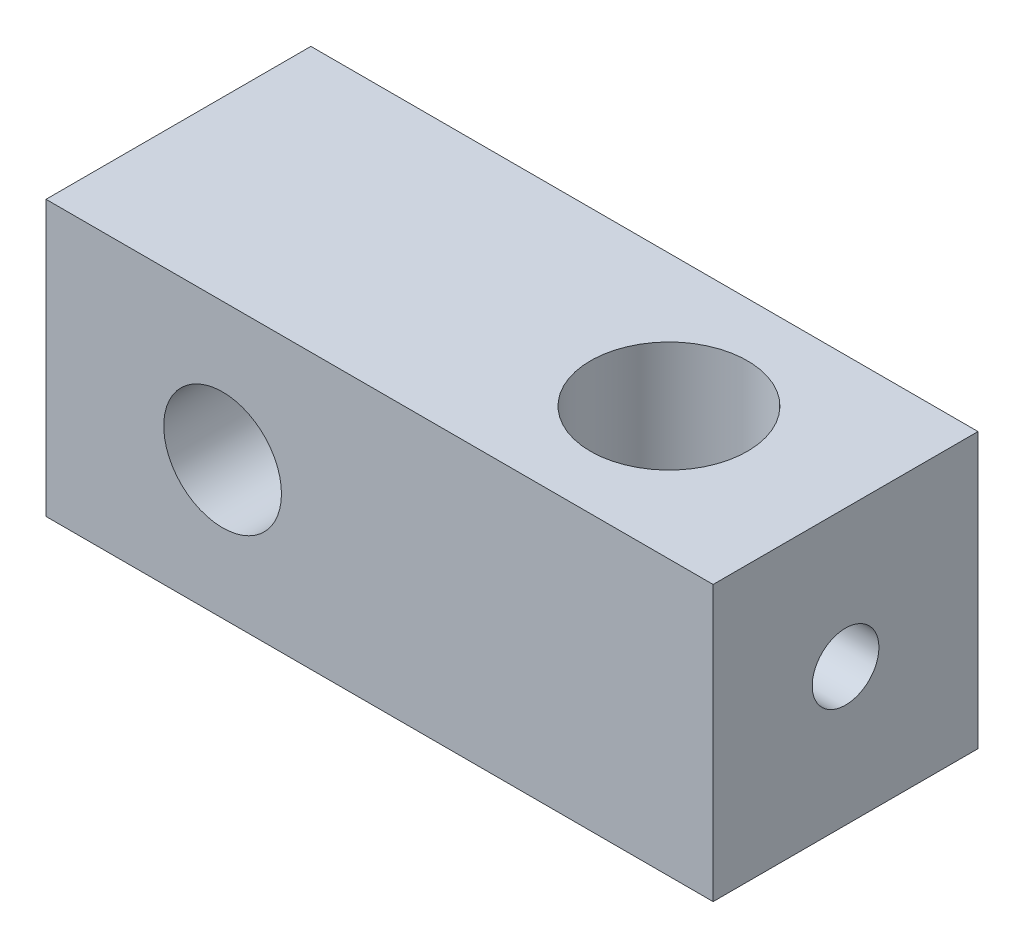
ISO-10303-21;
HEADER;
FILE_DESCRIPTION(('STEP AP214'),'2;1');
FILE_NAME('part.step','',(''),(''),'','','');
FILE_SCHEMA(('AUTOMOTIVE_DESIGN { 1 0 10303 214 1 1 1 1 }'));
ENDSEC;
DATA;
#1=APPLICATION_CONTEXT('core data for automotive mechanical design processes');
#2=APPLICATION_PROTOCOL_DEFINITION('international standard','automotive_design',2000,#1);
#3=PRODUCT_CONTEXT('',#1,'mechanical');
#4=PRODUCT('Part','Part','',(#3));
#5=PRODUCT_RELATED_PRODUCT_CATEGORY('part','',(#4));
#6=PRODUCT_DEFINITION_FORMATION('','',#4);
#7=PRODUCT_DEFINITION_CONTEXT('part definition',#1,'design');
#8=PRODUCT_DEFINITION('design','',#6,#7);
#9=PRODUCT_DEFINITION_SHAPE('','',#8);
#10=(LENGTH_UNIT() NAMED_UNIT(*) SI_UNIT(.MILLI.,.METRE.));
#11=(NAMED_UNIT(*) PLANE_ANGLE_UNIT() SI_UNIT($,.RADIAN.));
#12=(NAMED_UNIT(*) SI_UNIT($,.STERADIAN.) SOLID_ANGLE_UNIT());
#13=UNCERTAINTY_MEASURE_WITH_UNIT(LENGTH_MEASURE(1.E-05),#10,'distance_accuracy_value','');
#14=(GEOMETRIC_REPRESENTATION_CONTEXT(3) GLOBAL_UNCERTAINTY_ASSIGNED_CONTEXT((#13)) GLOBAL_UNIT_ASSIGNED_CONTEXT((#10,
#11,#12)) REPRESENTATION_CONTEXT('',''));
#15=CARTESIAN_POINT('',(0.,0.,0.));
#16=DIRECTION('',(0.,0.,1.));
#17=DIRECTION('',(1.,0.,0.));
#18=AXIS2_PLACEMENT_3D('',#15,#16,#17);
#19=CARTESIAN_POINT('',(0.,28.,0.));
#20=DIRECTION('',(1.,0.,0.));
#21=DIRECTION('',(0.,0.,-1.));
#22=AXIS2_PLACEMENT_3D('',#19,#20,#21);
#23=PLANE('',#22);
#24=DIRECTION('',(0.,0.,1.));
#25=VECTOR('',#24,1.);
#26=CARTESIAN_POINT('',(0.,0.,0.));
#27=LINE('',#26,#25);
#28=CARTESIAN_POINT('',(0.,0.,-27.));
#29=VERTEX_POINT('',#28);
#30=CARTESIAN_POINT('',(0.,0.,0.));
#31=VERTEX_POINT('',#30);
#32=EDGE_CURVE('E121',#29,#31,#27,.T.);
#33=ORIENTED_EDGE('',*,*,#32,.T.);
#34=DIRECTION('',(0.,-1.,0.));
#35=VECTOR('',#34,1.);
#36=CARTESIAN_POINT('',(0.,28.,0.));
#37=LINE('',#36,#35);
#38=CARTESIAN_POINT('',(0.,28.,0.));
#39=VERTEX_POINT('',#38);
#40=EDGE_CURVE('E11',#39,#31,#37,.T.);
#41=ORIENTED_EDGE('',*,*,#40,.F.);
#42=DIRECTION('',(0.,0.,1.));
#43=VECTOR('',#42,1.);
#44=CARTESIAN_POINT('',(0.,28.,0.));
#45=LINE('',#44,#43);
#46=CARTESIAN_POINT('',(0.,28.,-27.));
#47=VERTEX_POINT('',#46);
#48=EDGE_CURVE('E104',#47,#39,#45,.T.);
#49=ORIENTED_EDGE('',*,*,#48,.F.);
#50=DIRECTION('',(0.,-1.,0.));
#51=VECTOR('',#50,1.);
#52=CARTESIAN_POINT('',(0.,28.,-27.));
#53=LINE('',#52,#51);
#54=EDGE_CURVE('E117',#47,#29,#53,.T.);
#55=ORIENTED_EDGE('',*,*,#54,.T.);
#56=EDGE_LOOP('',(#33,#41,#49,#55));
#57=FACE_BOUND('',#56,.T.);
#58=ADVANCED_FACE('F45',(#57),#23,.F.);
#59=CARTESIAN_POINT('',(0.,28.,0.));
#60=DIRECTION('',(0.,0.,-1.));
#61=DIRECTION('',(-1.,0.,0.));
#62=AXIS2_PLACEMENT_3D('',#59,#60,#61);
#63=PLANE('',#62);
#64=CARTESIAN_POINT('',(18.,14.,0.));
#65=DIRECTION('',(0.,0.,1.));
#66=DIRECTION('',(1.,0.,0.));
#67=AXIS2_PLACEMENT_3D('',#64,#65,#66);
#68=CIRCLE('',#67,6.);
#69=CARTESIAN_POINT('',(24.,14.,0.));
#70=VERTEX_POINT('',#69);
#71=EDGE_CURVE('E137',#70,#70,#68,.T.);
#72=ORIENTED_EDGE('',*,*,#71,.F.);
#73=EDGE_LOOP('',(#72));
#74=FACE_BOUND('',#73,.T.);
#75=DIRECTION('',(1.,0.,0.));
#76=VECTOR('',#75,1.);
#77=CARTESIAN_POINT('',(0.,0.,0.));
#78=LINE('',#77,#76);
#79=CARTESIAN_POINT('',(68.,0.,0.));
#80=VERTEX_POINT('',#79);
#81=EDGE_CURVE('E109',#31,#80,#78,.T.);
#82=ORIENTED_EDGE('',*,*,#81,.T.);
#83=DIRECTION('',(0.,-1.,0.));
#84=VECTOR('',#83,1.);
#85=CARTESIAN_POINT('',(68.,28.,0.));
#86=LINE('',#85,#84);
#87=CARTESIAN_POINT('',(68.,28.,0.));
#88=VERTEX_POINT('',#87);
#89=EDGE_CURVE('E60',#88,#80,#86,.T.);
#90=ORIENTED_EDGE('',*,*,#89,.F.);
#91=DIRECTION('',(1.,0.,0.));
#92=VECTOR('',#91,1.);
#93=CARTESIAN_POINT('',(0.,28.,0.));
#94=LINE('',#93,#92);
#95=EDGE_CURVE('E99',#39,#88,#94,.T.);
#96=ORIENTED_EDGE('',*,*,#95,.F.);
#97=ORIENTED_EDGE('',*,*,#40,.T.);
#98=EDGE_LOOP('',(#82,#90,#96,#97));
#99=FACE_BOUND('',#98,.T.);
#100=ADVANCED_FACE('F108',(#74,#99),#63,.F.);
#101=CARTESIAN_POINT('',(68.,28.,0.));
#102=DIRECTION('',(-1.,0.,0.));
#103=DIRECTION('',(0.,0.,1.));
#104=AXIS2_PLACEMENT_3D('',#101,#102,#103);
#105=PLANE('',#104);
#106=CARTESIAN_POINT('',(68.,14.,-13.5));
#107=DIRECTION('',(1.,0.,0.));
#108=DIRECTION('',(0.,0.,-1.));
#109=AXIS2_PLACEMENT_3D('',#106,#107,#108);
#110=CIRCLE('',#109,3.4);
#111=CARTESIAN_POINT('',(68.,14.,-16.9));
#112=VERTEX_POINT('',#111);
#113=EDGE_CURVE('E155',#112,#112,#110,.T.);
#114=ORIENTED_EDGE('',*,*,#113,.F.);
#115=EDGE_LOOP('',(#114));
#116=FACE_BOUND('',#115,.T.);
#117=DIRECTION('',(0.,0.,-1.));
#118=VECTOR('',#117,1.);
#119=CARTESIAN_POINT('',(68.,0.,0.));
#120=LINE('',#119,#118);
#121=CARTESIAN_POINT('',(68.,0.,-27.));
#122=VERTEX_POINT('',#121);
#123=EDGE_CURVE('E86',#80,#122,#120,.T.);
#124=ORIENTED_EDGE('',*,*,#123,.T.);
#125=DIRECTION('',(0.,-1.,0.));
#126=VECTOR('',#125,1.);
#127=CARTESIAN_POINT('',(68.,28.,-27.));
#128=LINE('',#127,#126);
#129=CARTESIAN_POINT('',(68.,28.,-27.));
#130=VERTEX_POINT('',#129);
#131=EDGE_CURVE('E111',#130,#122,#128,.T.);
#132=ORIENTED_EDGE('',*,*,#131,.F.);
#133=DIRECTION('',(0.,0.,-1.));
#134=VECTOR('',#133,1.);
#135=CARTESIAN_POINT('',(68.,28.,0.));
#136=LINE('',#135,#134);
#137=EDGE_CURVE('E102',#88,#130,#136,.T.);
#138=ORIENTED_EDGE('',*,*,#137,.F.);
#139=ORIENTED_EDGE('',*,*,#89,.T.);
#140=EDGE_LOOP('',(#124,#132,#138,#139));
#141=FACE_BOUND('',#140,.T.);
#142=ADVANCED_FACE('F113',(#116,#141),#105,.F.);
#143=CARTESIAN_POINT('',(0.,28.,-27.));
#144=DIRECTION('',(0.,0.,1.));
#145=DIRECTION('',(1.,0.,0.));
#146=AXIS2_PLACEMENT_3D('',#143,#144,#145);
#147=PLANE('',#146);
#148=CARTESIAN_POINT('',(18.,14.,-27.));
#149=DIRECTION('',(0.,0.,1.));
#150=DIRECTION('',(1.,0.,0.));
#151=AXIS2_PLACEMENT_3D('',#148,#149,#150);
#152=CIRCLE('',#151,6.);
#153=CARTESIAN_POINT('',(24.,14.,-27.));
#154=VERTEX_POINT('',#153);
#155=EDGE_CURVE('E125',#154,#154,#152,.T.);
#156=ORIENTED_EDGE('',*,*,#155,.T.);
#157=EDGE_LOOP('',(#156));
#158=FACE_BOUND('',#157,.T.);
#159=DIRECTION('',(-1.,0.,0.));
#160=VECTOR('',#159,1.);
#161=CARTESIAN_POINT('',(0.,0.,-27.));
#162=LINE('',#161,#160);
#163=EDGE_CURVE('E92',#122,#29,#162,.T.);
#164=ORIENTED_EDGE('',*,*,#163,.T.);
#165=ORIENTED_EDGE('',*,*,#54,.F.);
#166=DIRECTION('',(-1.,0.,0.));
#167=VECTOR('',#166,1.);
#168=CARTESIAN_POINT('',(0.,28.,-27.));
#169=LINE('',#168,#167);
#170=EDGE_CURVE('E69',#130,#47,#169,.T.);
#171=ORIENTED_EDGE('',*,*,#170,.F.);
#172=ORIENTED_EDGE('',*,*,#131,.T.);
#173=EDGE_LOOP('',(#164,#165,#171,#172));
#174=FACE_BOUND('',#173,.T.);
#175=ADVANCED_FACE('F191',(#158,#174),#147,.F.);
#176=CARTESIAN_POINT('',(0.,28.,0.));
#177=DIRECTION('',(0.,-1.,0.));
#178=DIRECTION('',(0.,0.,-1.));
#179=AXIS2_PLACEMENT_3D('',#176,#177,#178);
#180=PLANE('',#179);
#181=CARTESIAN_POINT('',(50.,28.,-13.5));
#182=DIRECTION('',(0.,1.,0.));
#183=DIRECTION('',(0.,0.,1.));
#184=AXIS2_PLACEMENT_3D('',#181,#182,#183);
#185=CIRCLE('',#184,8.00000000000001);
#186=CARTESIAN_POINT('',(50.,28.,-5.49999999999999));
#187=VERTEX_POINT('',#186);
#188=EDGE_CURVE('E148',#187,#187,#185,.T.);
#189=ORIENTED_EDGE('',*,*,#188,.F.);
#190=EDGE_LOOP('',(#189));
#191=FACE_BOUND('',#190,.T.);
#192=ORIENTED_EDGE('',*,*,#48,.T.);
#193=ORIENTED_EDGE('',*,*,#95,.T.);
#194=ORIENTED_EDGE('',*,*,#137,.T.);
#195=ORIENTED_EDGE('',*,*,#170,.T.);
#196=EDGE_LOOP('',(#192,#193,#194,#195));
#197=FACE_BOUND('',#196,.T.);
#198=ADVANCED_FACE('F100',(#191,#197),#180,.F.);
#199=CARTESIAN_POINT('',(0.,0.,0.));
#200=DIRECTION('',(0.,-1.,0.));
#201=DIRECTION('',(0.,0.,-1.));
#202=AXIS2_PLACEMENT_3D('',#199,#200,#201);
#203=PLANE('',#202);
#204=CARTESIAN_POINT('',(50.,0.,-13.5));
#205=DIRECTION('',(0.,1.,0.));
#206=DIRECTION('',(0.,0.,1.));
#207=AXIS2_PLACEMENT_3D('',#204,#205,#206);
#208=CIRCLE('',#207,8.00000000000001);
#209=CARTESIAN_POINT('',(50.,0.,-5.49999999999999));
#210=VERTEX_POINT('',#209);
#211=EDGE_CURVE('E142',#210,#210,#208,.T.);
#212=ORIENTED_EDGE('',*,*,#211,.T.);
#213=EDGE_LOOP('',(#212));
#214=FACE_BOUND('',#213,.T.);
#215=ORIENTED_EDGE('',*,*,#32,.F.);
#216=ORIENTED_EDGE('',*,*,#163,.F.);
#217=ORIENTED_EDGE('',*,*,#123,.F.);
#218=ORIENTED_EDGE('',*,*,#81,.F.);
#219=EDGE_LOOP('',(#215,#216,#217,#218));
#220=FACE_BOUND('',#219,.T.);
#221=ADVANCED_FACE('F182',(#214,#220),#203,.T.);
#222=CARTESIAN_POINT('',(18.,14.,-28.));
#223=DIRECTION('',(0.,0.,1.));
#224=DIRECTION('',(1.,0.,0.));
#225=AXIS2_PLACEMENT_3D('',#222,#223,#224);
#226=CYLINDRICAL_SURFACE('',#225,6.);
#227=ORIENTED_EDGE('',*,*,#71,.T.);
#228=EDGE_LOOP('',(#227));
#229=FACE_BOUND('',#228,.T.);
#230=ORIENTED_EDGE('',*,*,#155,.F.);
#231=EDGE_LOOP('',(#230));
#232=FACE_BOUND('',#231,.T.);
#233=ADVANCED_FACE('F172',(#229,#232),#226,.F.);
#234=CARTESIAN_POINT('',(50.,0.,-13.5));
#235=DIRECTION('',(0.,1.,0.));
#236=DIRECTION('',(0.,0.,1.));
#237=AXIS2_PLACEMENT_3D('',#234,#235,#236);
#238=CYLINDRICAL_SURFACE('',#237,8.00000000000001);
#239=CARTESIAN_POINT('',(57.2415467960927,14.,-16.9));
#240=CARTESIAN_POINT('',(57.2415475223145,14.090523000141,-16.8999993048351));
#241=CARTESIAN_POINT('',(57.2432501570577,14.1810762398115,-16.8963793995367));
#242=CARTESIAN_POINT('',(57.2500037920436,14.3615194131624,-16.881938235935));
#243=CARTESIAN_POINT('',(57.2550569215367,14.4514088882637,-16.871112398221));
#244=CARTESIAN_POINT('',(57.2683535510448,14.6300030431196,-16.8423478309977));
#245=CARTESIAN_POINT('',(57.2766036834039,14.7187048606306,-16.8243943128444));
#246=CARTESIAN_POINT('',(57.2960135810282,14.8941106744954,-16.7815746593578));
#247=CARTESIAN_POINT('',(57.3071745735068,14.9808138113885,-16.7567056081546));
#248=CARTESIAN_POINT('',(57.3443948902762,15.2362532462927,-16.6723288058787));
#249=CARTESIAN_POINT('',(57.3742686933413,15.4012746787639,-16.6028947494226));
#250=CARTESIAN_POINT('',(57.4407524553743,15.7171947442924,-16.4398818001557));
#251=CARTESIAN_POINT('',(57.4773610096951,15.8680963124054,-16.346307940478));
#252=CARTESIAN_POINT('',(57.5558478905289,16.1614737157696,-16.1311613899811));
#253=CARTESIAN_POINT('',(57.597909486937,16.3029329494354,-16.0082662606224));
#254=CARTESIAN_POINT('',(57.6810587802591,16.563983049067,-15.7407471822551));
#255=CARTESIAN_POINT('',(57.7221460871855,16.6835652825733,-15.5961146967171));
#256=CARTESIAN_POINT('',(57.8009598479445,16.9027429682742,-15.2811562903083));
#257=CARTESIAN_POINT('',(57.838448693069,17.0011830704645,-15.109961399165));
#258=CARTESIAN_POINT('',(57.9035873868292,17.1674229235738,-14.7515591989667));
#259=CARTESIAN_POINT('',(57.9312417692688,17.2352367974497,-14.5643593179042));
#260=CARTESIAN_POINT('',(57.9722948157319,17.3345791988528,-14.1899590365545));
#261=CARTESIAN_POINT('',(57.9863813114222,17.3678659539145,-14.0033021438335));
#262=CARTESIAN_POINT('',(58.0012163144353,17.4029004598221,-13.6265567300351));
#263=CARTESIAN_POINT('',(58.0019704638142,17.4046615518764,-13.4364696946373));
#264=CARTESIAN_POINT('',(57.9904536989674,17.3774940595107,-13.0710830674141));
#265=CARTESIAN_POINT('',(57.9790038687823,17.3505001780629,-12.8956088152529));
#266=CARTESIAN_POINT('',(57.945503887991,17.2699187884587,-12.551956738725));
#267=CARTESIAN_POINT('',(57.9234529545244,17.2163293162862,-12.3837794542181));
#268=CARTESIAN_POINT('',(57.8704473748836,17.0834554496467,-12.0563925144878));
#269=CARTESIAN_POINT('',(57.839361689978,17.003790544129,-11.8973593877297));
#270=CARTESIAN_POINT('',(57.771306277104,16.8214093984071,-11.594500699336));
#271=CARTESIAN_POINT('',(57.7343344459863,16.7186849135013,-11.4506806040794));
#272=CARTESIAN_POINT('',(57.6550132711467,16.4843989842598,-11.1711825768709));
#273=CARTESIAN_POINT('',(57.6124683904616,16.3512810048689,-11.0368630333432));
#274=CARTESIAN_POINT('',(57.5287936350379,16.0643520973406,-10.7918523756802));
#275=CARTESIAN_POINT('',(57.487664357171,15.9105325716774,-10.681171128399));
#276=CARTESIAN_POINT('',(57.4100479939275,15.5797196623865,-10.4828899955935));
#277=CARTESIAN_POINT('',(57.3737764717974,15.4020991922604,-10.3962446148077));
#278=CARTESIAN_POINT('',(57.3125751389502,15.0328389675499,-10.2546549563848));
#279=CARTESIAN_POINT('',(57.2876368409208,14.8412098291523,-10.199686947654));
#280=CARTESIAN_POINT('',(57.2540549874696,14.4630033960288,-10.1265431787801));
#281=CARTESIAN_POINT('',(57.2444354669416,14.276941764943,-10.1061578007005));
#282=CARTESIAN_POINT('',(57.2397864567067,13.9038475349921,-10.0962459144493));
#283=CARTESIAN_POINT('',(57.2447515698974,13.7168153208653,-10.1067079910579));
#284=CARTESIAN_POINT('',(57.2677007836678,13.3604632348198,-10.1561755331975));
#285=CARTESIAN_POINT('',(57.2847794937338,13.1908021558685,-10.1931979285059));
#286=CARTESIAN_POINT('',(57.3288573157861,12.8602543390441,-10.2920788063257));
#287=CARTESIAN_POINT('',(57.3558588095276,12.6993697184311,-10.3539432519784));
#288=CARTESIAN_POINT('',(57.418155880465,12.3831730982153,-10.5037038494901));
#289=CARTESIAN_POINT('',(57.453759101987,12.2284012075454,-10.5926081843792));
#290=CARTESIAN_POINT('',(57.5288267845517,11.9352098806856,-10.7929354624785));
#291=CARTESIAN_POINT('',(57.568292959346,11.7967977629683,-10.9043684238078));
#292=CARTESIAN_POINT('',(57.6507033320898,11.5279524322484,-11.1577914134893));
#293=CARTESIAN_POINT('',(57.6936568795266,11.3992085337445,-11.3015777532121));
#294=CARTESIAN_POINT('',(57.775094422012,11.1673517793151,-11.6096897821225));
#295=CARTESIAN_POINT('',(57.8135780068353,11.0642412748746,-11.774017353588));
#296=CARTESIAN_POINT('',(57.8820621544167,10.8865339544999,-12.1200399356097));
#297=CARTESIAN_POINT('',(57.9120266330388,10.8120579695725,-12.3018045849438));
#298=CARTESIAN_POINT('',(57.9597824255069,10.6953059911361,-12.6768895668225));
#299=CARTESIAN_POINT('',(57.9775813090395,10.6530099727246,-12.8702026321183));
#300=CARTESIAN_POINT('',(57.9980979919636,10.6044137958969,-13.2478300872842));
#301=CARTESIAN_POINT('',(58.0018120661472,10.5957347332077,-13.4317861640825));
#302=CARTESIAN_POINT('',(57.9965308636915,10.6081651720132,-13.7984821752929));
#303=CARTESIAN_POINT('',(57.9875379776462,10.6292690703594,-13.9812223319614));
#304=CARTESIAN_POINT('',(57.958387663913,10.6989584642508,-14.3331209503922));
#305=CARTESIAN_POINT('',(57.9386676305024,10.7464688021909,-14.5025316357076));
#306=CARTESIAN_POINT('',(57.8902653082331,10.8664255955909,-14.830895464594));
#307=CARTESIAN_POINT('',(57.8615813535117,10.9388766863158,-14.9898466577119));
#308=CARTESIAN_POINT('',(57.7963864144561,11.1103278522291,-15.3007606854267));
#309=CARTESIAN_POINT('',(57.7595785811019,11.210386305035,-15.4520760609098));
#310=CARTESIAN_POINT('',(57.6824570173615,11.4327056868348,-15.7364244591638));
#311=CARTESIAN_POINT('',(57.6421419276071,11.5549752447299,-15.8694503411486));
#312=CARTESIAN_POINT('',(57.5589272557309,11.8284691310568,-16.1233025180441));
#313=CARTESIAN_POINT('',(57.5160481950464,11.981135794057,-16.2425842343461));
#314=CARTESIAN_POINT('',(57.4354554360013,12.3057172002038,-16.454128786207));
#315=CARTESIAN_POINT('',(57.3977447107058,12.4776429195736,-16.5463761047725));
#316=CARTESIAN_POINT('',(57.3487484219836,12.7462530457711,-16.6619026830951));
#317=CARTESIAN_POINT('',(57.3336873950426,12.8374959442463,-16.6965846682851));
#318=CARTESIAN_POINT('',(57.3065791331701,13.0230171931167,-16.7580722537828));
#319=CARTESIAN_POINT('',(57.2945304113377,13.1172940198946,-16.7848817411711));
#320=CARTESIAN_POINT('',(57.273927971836,13.3079108517549,-16.8302539596082));
#321=CARTESIAN_POINT('',(57.265365047378,13.404244705209,-16.8488384263037));
#322=CARTESIAN_POINT('',(57.2520307552947,13.5983682543946,-16.8776182270358));
#323=CARTESIAN_POINT('',(57.2472564692762,13.6961567703248,-16.8878200184738));
#324=CARTESIAN_POINT('',(57.2434968198859,13.8284682187669,-16.8958439893061));
#325=CARTESIAN_POINT('',(57.2427661081908,13.8627502383715,-16.8974019926485));
#326=CARTESIAN_POINT('',(57.2417909552516,13.9313533889592,-16.8994801369547));
#327=CARTESIAN_POINT('',(57.2415465207162,13.9656745204754,-16.9000002636));
#328=CARTESIAN_POINT('',(57.2415467960927,14.,-16.9));
#329=B_SPLINE_CURVE_WITH_KNOTS('',3,(#239,#240,#241,#242,#243,#244,#245,#246,#247,#248,#249,
#250,#251,#252,#253,#254,#255,#256,#257,#258,#259,#260,#261,#262,#263,#264,#265,#266,#267,#268,
#269,#270,#271,#272,#273,#274,#275,#276,#277,#278,#279,#280,#281,#282,#283,#284,#285,#286,#287,
#288,#289,#290,#291,#292,#293,#294,#295,#296,#297,#298,#299,#300,#301,#302,#303,#304,#305,#306,
#307,#308,#309,#310,#311,#312,#313,#314,#315,#316,#317,#318,#319,#320,#321,#322,#323,#324,#325,
#326,#327,#328),.UNSPECIFIED.,.T.,.F.,(4,2,2,2,2,2,2,2,2,2,2,2,2,2,2,2,2,2,2,2,2,2,2,2,2,2,2,2,
2,2,2,2,2,2,2,2,2,2,2,2,2,2,2,2,4),(0.,0.271533101303065,0.54323892838811,0.81551146690741,
1.08789898112825,1.62979796627975,2.17158405703762,2.74521548008885,3.31907276680708,
3.91901055560994,4.518671406341,5.08602169361363,5.65313188070349,6.18436069062124,
6.71562873626018,7.25502349345062,7.79461141340451,8.37354466653554,8.95271910176149,
9.55237239074671,10.1515758637073,10.7108099920759,11.2698371996708,11.7909672889951,
12.3122225463985,12.8559725303037,13.3999648450627,13.9903875055115,14.5808643085448,
15.1738061326552,15.7663786793264,16.3161578611251,16.8658336252783,17.3946144745139,
17.9234936513282,18.4764471857591,19.029616001036,19.622198872516,20.2151212069326,
20.5110879967455,20.8069084049778,21.1019423336194,21.3967487760209,21.4997101815325,
21.602673007494),.UNSPECIFIED.);
#330=CARTESIAN_POINT('',(57.2415467960927,14.,-16.9));
#331=VERTEX_POINT('',#330);
#332=EDGE_CURVE('E48',#331,#331,#329,.T.);
#333=ORIENTED_EDGE('',*,*,#332,.T.);
#334=EDGE_LOOP('',(#333));
#335=FACE_BOUND('',#334,.T.);
#336=ORIENTED_EDGE('',*,*,#211,.F.);
#337=EDGE_LOOP('',(#336));
#338=FACE_BOUND('',#337,.T.);
#339=ORIENTED_EDGE('',*,*,#188,.T.);
#340=EDGE_LOOP('',(#339));
#341=FACE_BOUND('',#340,.T.);
#342=ADVANCED_FACE('F164',(#335,#338,#341),#238,.F.);
#343=CARTESIAN_POINT('',(68.,14.,-13.5));
#344=DIRECTION('',(1.,0.,0.));
#345=DIRECTION('',(0.,0.,-1.));
#346=AXIS2_PLACEMENT_3D('',#343,#344,#345);
#347=CYLINDRICAL_SURFACE('',#346,3.4);
#348=ORIENTED_EDGE('',*,*,#113,.T.);
#349=EDGE_LOOP('',(#348));
#350=FACE_BOUND('',#349,.T.);
#351=ORIENTED_EDGE('',*,*,#332,.F.);
#352=EDGE_LOOP('',(#351));
#353=FACE_BOUND('',#352,.T.);
#354=ADVANCED_FACE('F167',(#350,#353),#347,.F.);
#355=CLOSED_SHELL('',(#58,#100,#142,#175,#198,#221,#233,#342,#354));
#356=MANIFOLD_SOLID_BREP('B2',#355);
#357=ADVANCED_BREP_SHAPE_REPRESENTATION('',(#18,#356),#14);
#358=SHAPE_DEFINITION_REPRESENTATION(#9,#357);
ENDSEC;
END-ISO-10303-21;
